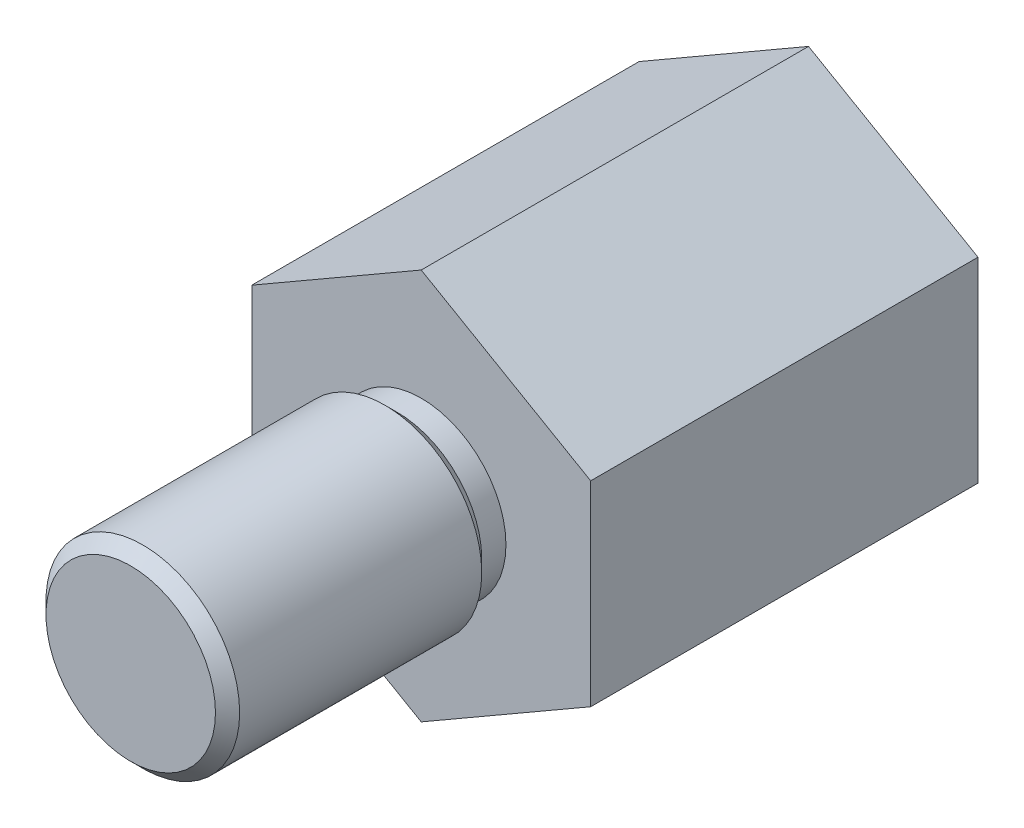
ISO-10303-21;
HEADER;
FILE_DESCRIPTION(('STEP AP214'),'2;1');
FILE_NAME('part.step','',(''),(''),'','','');
FILE_SCHEMA(('AUTOMOTIVE_DESIGN { 1 0 10303 214 1 1 1 1 }'));
ENDSEC;
DATA;
#1=APPLICATION_CONTEXT('core data for automotive mechanical design processes');
#2=APPLICATION_PROTOCOL_DEFINITION('international standard','automotive_design',2000,#1);
#3=PRODUCT_CONTEXT('',#1,'mechanical');
#4=PRODUCT('Part','Part','',(#3));
#5=PRODUCT_RELATED_PRODUCT_CATEGORY('part','',(#4));
#6=PRODUCT_DEFINITION_FORMATION('','',#4);
#7=PRODUCT_DEFINITION_CONTEXT('part definition',#1,'design');
#8=PRODUCT_DEFINITION('design','',#6,#7);
#9=PRODUCT_DEFINITION_SHAPE('','',#8);
#10=(LENGTH_UNIT() NAMED_UNIT(*) SI_UNIT(.MILLI.,.METRE.));
#11=(NAMED_UNIT(*) PLANE_ANGLE_UNIT() SI_UNIT($,.RADIAN.));
#12=(NAMED_UNIT(*) SI_UNIT($,.STERADIAN.) SOLID_ANGLE_UNIT());
#13=UNCERTAINTY_MEASURE_WITH_UNIT(LENGTH_MEASURE(1.E-05),#10,'distance_accuracy_value','');
#14=(GEOMETRIC_REPRESENTATION_CONTEXT(3) GLOBAL_UNCERTAINTY_ASSIGNED_CONTEXT((#13)) GLOBAL_UNIT_ASSIGNED_CONTEXT((#10,
#11,#12)) REPRESENTATION_CONTEXT('',''));
#15=CARTESIAN_POINT('',(0.,0.,0.));
#16=DIRECTION('',(0.,0.,1.));
#17=DIRECTION('',(1.,0.,0.));
#18=AXIS2_PLACEMENT_3D('',#15,#16,#17);
#19=CARTESIAN_POINT('',(0.,4.04145188432737,8.));
#20=DIRECTION('',(0.,0.,1.));
#21=DIRECTION('',(1.,0.,0.));
#22=AXIS2_PLACEMENT_3D('',#19,#20,#21);
#23=PLANE('',#22);
#24=DIRECTION('',(-0.866025403784438,0.5,0.));
#25=VECTOR('',#24,1.);
#26=CARTESIAN_POINT('',(3.49999999999999,2.02072594216368,8.));
#27=LINE('',#26,#25);
#28=CARTESIAN_POINT('',(3.49999999999999,2.02072594216368,8.));
#29=VERTEX_POINT('',#28);
#30=CARTESIAN_POINT('',(0.,4.04145188432737,8.));
#31=VERTEX_POINT('',#30);
#32=EDGE_CURVE('E130',#29,#31,#27,.T.);
#33=ORIENTED_EDGE('',*,*,#32,.T.);
#34=DIRECTION('',(-0.866025403784438,-0.5,0.));
#35=VECTOR('',#34,1.);
#36=CARTESIAN_POINT('',(0.,4.04145188432737,8.));
#37=LINE('',#36,#35);
#38=CARTESIAN_POINT('',(-3.5,2.02072594216368,8.));
#39=VERTEX_POINT('',#38);
#40=EDGE_CURVE('E87',#31,#39,#37,.T.);
#41=ORIENTED_EDGE('',*,*,#40,.T.);
#42=DIRECTION('',(0.,-1.,0.));
#43=VECTOR('',#42,1.);
#44=CARTESIAN_POINT('',(-3.5,2.02072594216368,8.));
#45=LINE('',#44,#43);
#46=CARTESIAN_POINT('',(-3.5,-2.0207259421637,8.));
#47=VERTEX_POINT('',#46);
#48=EDGE_CURVE('E101',#39,#47,#45,.T.);
#49=ORIENTED_EDGE('',*,*,#48,.T.);
#50=DIRECTION('',(0.866025403784438,-0.5,0.));
#51=VECTOR('',#50,1.);
#52=CARTESIAN_POINT('',(-3.5,-2.0207259421637,8.));
#53=LINE('',#52,#51);
#54=CARTESIAN_POINT('',(0.,-4.04145188432739,8.));
#55=VERTEX_POINT('',#54);
#56=EDGE_CURVE('E95',#47,#55,#53,.T.);
#57=ORIENTED_EDGE('',*,*,#56,.T.);
#58=DIRECTION('',(0.866025403784439,0.5,0.));
#59=VECTOR('',#58,1.);
#60=CARTESIAN_POINT('',(0.,-4.04145188432739,8.));
#61=LINE('',#60,#59);
#62=CARTESIAN_POINT('',(3.49999999999999,-2.0207259421637,8.));
#63=VERTEX_POINT('',#62);
#64=EDGE_CURVE('E99',#55,#63,#61,.T.);
#65=ORIENTED_EDGE('',*,*,#64,.T.);
#66=DIRECTION('',(0.,1.,0.));
#67=VECTOR('',#66,1.);
#68=CARTESIAN_POINT('',(3.49999999999999,-2.0207259421637,8.));
#69=LINE('',#68,#67);
#70=EDGE_CURVE('E48',#63,#29,#69,.T.);
#71=ORIENTED_EDGE('',*,*,#70,.T.);
#72=EDGE_LOOP('',(#33,#41,#49,#57,#65,#71));
#73=FACE_BOUND('',#72,.T.);
#74=CARTESIAN_POINT('',(0.,0.,8.));
#75=DIRECTION('',(0.,0.,1.));
#76=DIRECTION('',(1.,0.,0.));
#77=AXIS2_PLACEMENT_3D('',#74,#75,#76);
#78=CIRCLE('',#77,1.75);
#79=CARTESIAN_POINT('',(1.75,0.,8.));
#80=VERTEX_POINT('',#79);
#81=EDGE_CURVE('E197',#80,#80,#78,.T.);
#82=ORIENTED_EDGE('',*,*,#81,.F.);
#83=EDGE_LOOP('',(#82));
#84=FACE_BOUND('',#83,.T.);
#85=ADVANCED_FACE('F31',(#73,#84),#23,.T.);
#86=CARTESIAN_POINT('',(3.49999999999999,2.02072594216368,8.));
#87=DIRECTION('',(-0.5,-0.866025403784438,0.));
#88=DIRECTION('',(0.866025403784438,-0.5,0.));
#89=AXIS2_PLACEMENT_3D('',#86,#87,#88);
#90=PLANE('',#89);
#91=DIRECTION('',(-0.866025403784438,0.5,0.));
#92=VECTOR('',#91,1.);
#93=CARTESIAN_POINT('',(3.49999999999999,2.02072594216368,0.));
#94=LINE('',#93,#92);
#95=CARTESIAN_POINT('',(3.49999999999999,2.02072594216368,0.));
#96=VERTEX_POINT('',#95);
#97=CARTESIAN_POINT('',(0.,4.04145188432737,0.));
#98=VERTEX_POINT('',#97);
#99=EDGE_CURVE('E119',#96,#98,#94,.T.);
#100=ORIENTED_EDGE('',*,*,#99,.T.);
#101=DIRECTION('',(0.,0.,-1.));
#102=VECTOR('',#101,1.);
#103=CARTESIAN_POINT('',(0.,4.04145188432737,8.));
#104=LINE('',#103,#102);
#105=EDGE_CURVE('E137',#31,#98,#104,.T.);
#106=ORIENTED_EDGE('',*,*,#105,.F.);
#107=ORIENTED_EDGE('',*,*,#32,.F.);
#108=DIRECTION('',(0.,0.,-1.));
#109=VECTOR('',#108,1.);
#110=CARTESIAN_POINT('',(3.49999999999999,2.02072594216368,8.));
#111=LINE('',#110,#109);
#112=EDGE_CURVE('E115',#29,#96,#111,.T.);
#113=ORIENTED_EDGE('',*,*,#112,.T.);
#114=EDGE_LOOP('',(#100,#106,#107,#113));
#115=FACE_BOUND('',#114,.T.);
#116=ADVANCED_FACE('F161',(#115),#90,.F.);
#117=CARTESIAN_POINT('',(0.,4.04145188432737,8.));
#118=DIRECTION('',(0.5,-0.866025403784438,0.));
#119=DIRECTION('',(0.866025403784438,0.5,0.));
#120=AXIS2_PLACEMENT_3D('',#117,#118,#119);
#121=PLANE('',#120);
#122=DIRECTION('',(-0.866025403784438,-0.5,0.));
#123=VECTOR('',#122,1.);
#124=CARTESIAN_POINT('',(0.,4.04145188432737,0.));
#125=LINE('',#124,#123);
#126=CARTESIAN_POINT('',(-3.5,2.02072594216368,0.));
#127=VERTEX_POINT('',#126);
#128=EDGE_CURVE('E122',#98,#127,#125,.T.);
#129=ORIENTED_EDGE('',*,*,#128,.T.);
#130=DIRECTION('',(0.,0.,-1.));
#131=VECTOR('',#130,1.);
#132=CARTESIAN_POINT('',(-3.5,2.02072594216368,8.));
#133=LINE('',#132,#131);
#134=EDGE_CURVE('E134',#39,#127,#133,.T.);
#135=ORIENTED_EDGE('',*,*,#134,.F.);
#136=ORIENTED_EDGE('',*,*,#40,.F.);
#137=ORIENTED_EDGE('',*,*,#105,.T.);
#138=EDGE_LOOP('',(#129,#135,#136,#137));
#139=FACE_BOUND('',#138,.T.);
#140=ADVANCED_FACE('F166',(#139),#121,.F.);
#141=CARTESIAN_POINT('',(-3.5,2.02072594216368,8.));
#142=DIRECTION('',(1.,0.,0.));
#143=DIRECTION('',(0.,0.,-1.));
#144=AXIS2_PLACEMENT_3D('',#141,#142,#143);
#145=PLANE('',#144);
#146=DIRECTION('',(0.,-1.,0.));
#147=VECTOR('',#146,1.);
#148=CARTESIAN_POINT('',(-3.5,2.02072594216368,0.));
#149=LINE('',#148,#147);
#150=CARTESIAN_POINT('',(-3.5,-2.0207259421637,0.));
#151=VERTEX_POINT('',#150);
#152=EDGE_CURVE('E125',#127,#151,#149,.T.);
#153=ORIENTED_EDGE('',*,*,#152,.T.);
#154=DIRECTION('',(0.,0.,-1.));
#155=VECTOR('',#154,1.);
#156=CARTESIAN_POINT('',(-3.5,-2.0207259421637,8.));
#157=LINE('',#156,#155);
#158=EDGE_CURVE('E110',#47,#151,#157,.T.);
#159=ORIENTED_EDGE('',*,*,#158,.F.);
#160=ORIENTED_EDGE('',*,*,#48,.F.);
#161=ORIENTED_EDGE('',*,*,#134,.T.);
#162=EDGE_LOOP('',(#153,#159,#160,#161));
#163=FACE_BOUND('',#162,.T.);
#164=ADVANCED_FACE('F182',(#163),#145,.F.);
#165=CARTESIAN_POINT('',(-3.5,-2.0207259421637,8.));
#166=DIRECTION('',(0.5,0.866025403784439,0.));
#167=DIRECTION('',(-0.866025403784439,0.5,0.));
#168=AXIS2_PLACEMENT_3D('',#165,#166,#167);
#169=PLANE('',#168);
#170=DIRECTION('',(0.866025403784438,-0.5,0.));
#171=VECTOR('',#170,1.);
#172=CARTESIAN_POINT('',(-3.5,-2.0207259421637,0.));
#173=LINE('',#172,#171);
#174=CARTESIAN_POINT('',(0.,-4.04145188432739,0.));
#175=VERTEX_POINT('',#174);
#176=EDGE_CURVE('E109',#151,#175,#173,.T.);
#177=ORIENTED_EDGE('',*,*,#176,.T.);
#178=DIRECTION('',(0.,0.,-1.));
#179=VECTOR('',#178,1.);
#180=CARTESIAN_POINT('',(0.,-4.04145188432739,8.));
#181=LINE('',#180,#179);
#182=EDGE_CURVE('E106',#55,#175,#181,.T.);
#183=ORIENTED_EDGE('',*,*,#182,.F.);
#184=ORIENTED_EDGE('',*,*,#56,.F.);
#185=ORIENTED_EDGE('',*,*,#158,.T.);
#186=EDGE_LOOP('',(#177,#183,#184,#185));
#187=FACE_BOUND('',#186,.T.);
#188=ADVANCED_FACE('F107',(#187),#169,.F.);
#189=CARTESIAN_POINT('',(0.,-4.04145188432739,8.));
#190=DIRECTION('',(-0.5,0.866025403784439,0.));
#191=DIRECTION('',(-0.866025403784439,-0.5,0.));
#192=AXIS2_PLACEMENT_3D('',#189,#190,#191);
#193=PLANE('',#192);
#194=DIRECTION('',(0.866025403784439,0.5,0.));
#195=VECTOR('',#194,1.);
#196=CARTESIAN_POINT('',(0.,-4.04145188432739,0.));
#197=LINE('',#196,#195);
#198=CARTESIAN_POINT('',(3.49999999999999,-2.0207259421637,0.));
#199=VERTEX_POINT('',#198);
#200=EDGE_CURVE('E72',#175,#199,#197,.T.);
#201=ORIENTED_EDGE('',*,*,#200,.T.);
#202=DIRECTION('',(0.,0.,-1.));
#203=VECTOR('',#202,1.);
#204=CARTESIAN_POINT('',(3.49999999999999,-2.0207259421637,8.));
#205=LINE('',#204,#203);
#206=EDGE_CURVE('E111',#63,#199,#205,.T.);
#207=ORIENTED_EDGE('',*,*,#206,.F.);
#208=ORIENTED_EDGE('',*,*,#64,.F.);
#209=ORIENTED_EDGE('',*,*,#182,.T.);
#210=EDGE_LOOP('',(#201,#207,#208,#209));
#211=FACE_BOUND('',#210,.T.);
#212=ADVANCED_FACE('F113',(#211),#193,.F.);
#213=CARTESIAN_POINT('',(3.49999999999999,-2.0207259421637,8.));
#214=DIRECTION('',(-1.,0.,0.));
#215=DIRECTION('',(0.,-1.,0.));
#216=AXIS2_PLACEMENT_3D('',#213,#214,#215);
#217=PLANE('',#216);
#218=DIRECTION('',(0.,1.,0.));
#219=VECTOR('',#218,1.);
#220=CARTESIAN_POINT('',(3.49999999999999,-2.0207259421637,0.));
#221=LINE('',#220,#219);
#222=EDGE_CURVE('E78',#199,#96,#221,.T.);
#223=ORIENTED_EDGE('',*,*,#222,.T.);
#224=ORIENTED_EDGE('',*,*,#112,.F.);
#225=ORIENTED_EDGE('',*,*,#70,.F.);
#226=ORIENTED_EDGE('',*,*,#206,.T.);
#227=EDGE_LOOP('',(#223,#224,#225,#226));
#228=FACE_BOUND('',#227,.T.);
#229=ADVANCED_FACE('F174',(#228),#217,.F.);
#230=CARTESIAN_POINT('',(0.,4.04145188432737,0.));
#231=DIRECTION('',(0.,0.,1.));
#232=DIRECTION('',(1.,0.,0.));
#233=AXIS2_PLACEMENT_3D('',#230,#231,#232);
#234=PLANE('',#233);
#235=CARTESIAN_POINT('',(0.,0.,0.));
#236=DIRECTION('',(0.,0.,-1.));
#237=DIRECTION('',(-1.,0.,0.));
#238=AXIS2_PLACEMENT_3D('',#235,#236,#237);
#239=CIRCLE('',#238,2.);
#240=CARTESIAN_POINT('',(-2.,0.,0.));
#241=VERTEX_POINT('',#240);
#242=EDGE_CURVE('E200',#241,#241,#239,.T.);
#243=ORIENTED_EDGE('',*,*,#242,.F.);
#244=EDGE_LOOP('',(#243));
#245=FACE_BOUND('',#244,.T.);
#246=ORIENTED_EDGE('',*,*,#99,.F.);
#247=ORIENTED_EDGE('',*,*,#222,.F.);
#248=ORIENTED_EDGE('',*,*,#200,.F.);
#249=ORIENTED_EDGE('',*,*,#176,.F.);
#250=ORIENTED_EDGE('',*,*,#152,.F.);
#251=ORIENTED_EDGE('',*,*,#128,.F.);
#252=EDGE_LOOP('',(#246,#247,#248,#249,#250,#251));
#253=FACE_BOUND('',#252,.T.);
#254=ADVANCED_FACE('F170',(#245,#253),#234,.F.);
#255=CARTESIAN_POINT('',(0.,0.,8.5));
#256=DIRECTION('',(0.,0.,-1.));
#257=DIRECTION('',(-1.,0.,0.));
#258=AXIS2_PLACEMENT_3D('',#255,#256,#257);
#259=CYLINDRICAL_SURFACE('',#258,1.75);
#260=CARTESIAN_POINT('',(0.,0.,8.5));
#261=DIRECTION('',(0.,0.,1.));
#262=DIRECTION('',(1.,0.,0.));
#263=AXIS2_PLACEMENT_3D('',#260,#261,#262);
#264=CIRCLE('',#263,1.75);
#265=CARTESIAN_POINT('',(1.75,0.,8.5));
#266=VERTEX_POINT('',#265);
#267=EDGE_CURVE('E123',#266,#266,#264,.T.);
#268=ORIENTED_EDGE('',*,*,#267,.F.);
#269=EDGE_LOOP('',(#268));
#270=FACE_BOUND('',#269,.T.);
#271=ORIENTED_EDGE('',*,*,#81,.T.);
#272=EDGE_LOOP('',(#271));
#273=FACE_BOUND('',#272,.T.);
#274=ADVANCED_FACE('F173',(#270,#273),#259,.T.);
#275=CARTESIAN_POINT('',(0.,0.,14.));
#276=DIRECTION('',(0.,0.,1.));
#277=DIRECTION('',(1.,0.,0.));
#278=AXIS2_PLACEMENT_3D('',#275,#276,#277);
#279=PLANE('',#278);
#280=CARTESIAN_POINT('',(0.,0.,14.));
#281=DIRECTION('',(0.,0.,1.));
#282=DIRECTION('',(1.,0.,0.));
#283=AXIS2_PLACEMENT_3D('',#280,#281,#282);
#284=CIRCLE('',#283,1.75);
#285=CARTESIAN_POINT('',(1.75,0.,14.));
#286=VERTEX_POINT('',#285);
#287=EDGE_CURVE('E11',#286,#286,#284,.T.);
#288=ORIENTED_EDGE('',*,*,#287,.T.);
#289=EDGE_LOOP('',(#288));
#290=FACE_BOUND('',#289,.T.);
#291=ADVANCED_FACE('F156',(#290),#279,.T.);
#292=CARTESIAN_POINT('',(0.,0.,14.));
#293=DIRECTION('',(0.,0.,-1.));
#294=DIRECTION('',(-1.,0.,0.));
#295=AXIS2_PLACEMENT_3D('',#292,#293,#294);
#296=CYLINDRICAL_SURFACE('',#295,2.);
#297=CARTESIAN_POINT('',(0.,0.,8.75));
#298=DIRECTION('',(0.,0.,1.));
#299=DIRECTION('',(1.,0.,0.));
#300=AXIS2_PLACEMENT_3D('',#297,#298,#299);
#301=CIRCLE('',#300,2.);
#302=CARTESIAN_POINT('',(2.,0.,8.75));
#303=VERTEX_POINT('',#302);
#304=EDGE_CURVE('E40',#303,#303,#301,.T.);
#305=ORIENTED_EDGE('',*,*,#304,.T.);
#306=EDGE_LOOP('',(#305));
#307=FACE_BOUND('',#306,.T.);
#308=CARTESIAN_POINT('',(0.,0.,13.75));
#309=DIRECTION('',(0.,0.,1.));
#310=DIRECTION('',(1.,0.,0.));
#311=AXIS2_PLACEMENT_3D('',#308,#309,#310);
#312=CIRCLE('',#311,2.);
#313=CARTESIAN_POINT('',(2.,0.,13.75));
#314=VERTEX_POINT('',#313);
#315=EDGE_CURVE('E139',#314,#314,#312,.F.);
#316=ORIENTED_EDGE('',*,*,#315,.T.);
#317=EDGE_LOOP('',(#316));
#318=FACE_BOUND('',#317,.T.);
#319=ADVANCED_FACE('F144',(#307,#318),#296,.T.);
#320=CARTESIAN_POINT('',(0.,0.,8.75));
#321=DIRECTION('',(0.,0.,1.));
#322=DIRECTION('',(1.,0.,0.));
#323=AXIS2_PLACEMENT_3D('',#320,#321,#322);
#324=CONICAL_SURFACE('',#323,2.,0.785398163397455);
#325=ORIENTED_EDGE('',*,*,#267,.T.);
#326=EDGE_LOOP('',(#325));
#327=FACE_BOUND('',#326,.T.);
#328=ORIENTED_EDGE('',*,*,#304,.F.);
#329=EDGE_LOOP('',(#328));
#330=FACE_BOUND('',#329,.T.);
#331=ADVANCED_FACE('F147',(#327,#330),#324,.T.);
#332=CARTESIAN_POINT('',(0.,0.,14.));
#333=DIRECTION('',(0.,0.,-1.));
#334=DIRECTION('',(-1.,0.,0.));
#335=AXIS2_PLACEMENT_3D('',#332,#333,#334);
#336=CONICAL_SURFACE('',#335,1.75,0.785398163397447);
#337=ORIENTED_EDGE('',*,*,#315,.F.);
#338=EDGE_LOOP('',(#337));
#339=FACE_BOUND('',#338,.T.);
#340=ORIENTED_EDGE('',*,*,#287,.F.);
#341=EDGE_LOOP('',(#340));
#342=FACE_BOUND('',#341,.T.);
#343=ADVANCED_FACE('F33',(#339,#342),#336,.T.);
#344=CARTESIAN_POINT('',(0.,0.,0.));
#345=DIRECTION('',(0.,0.,-1.));
#346=DIRECTION('',(-1.,0.,0.));
#347=AXIS2_PLACEMENT_3D('',#344,#345,#346);
#348=CONICAL_SURFACE('',#347,2.,0.785398163397446);
#349=CARTESIAN_POINT('',(0.,0.,0.350000000000001));
#350=DIRECTION('',(0.,0.,-1.));
#351=DIRECTION('',(-1.,0.,0.));
#352=AXIS2_PLACEMENT_3D('',#349,#350,#351);
#353=CIRCLE('',#352,1.65);
#354=CARTESIAN_POINT('',(-1.65,0.,0.350000000000001));
#355=VERTEX_POINT('',#354);
#356=EDGE_CURVE('E204',#355,#355,#353,.T.);
#357=ORIENTED_EDGE('',*,*,#356,.F.);
#358=EDGE_LOOP('',(#357));
#359=FACE_BOUND('',#358,.T.);
#360=ORIENTED_EDGE('',*,*,#242,.T.);
#361=EDGE_LOOP('',(#360));
#362=FACE_BOUND('',#361,.T.);
#363=ADVANCED_FACE('F154',(#359,#362),#348,.F.);
#364=CARTESIAN_POINT('',(0.,0.,0.));
#365=DIRECTION('',(0.,0.,-1.));
#366=DIRECTION('',(-1.,0.,0.));
#367=AXIS2_PLACEMENT_3D('',#364,#365,#366);
#368=CYLINDRICAL_SURFACE('',#367,1.65);
#369=CARTESIAN_POINT('',(0.,0.,6.));
#370=DIRECTION('',(0.,0.,-1.));
#371=DIRECTION('',(-1.,0.,0.));
#372=AXIS2_PLACEMENT_3D('',#369,#370,#371);
#373=CIRCLE('',#372,1.65);
#374=CARTESIAN_POINT('',(-1.65,0.,6.));
#375=VERTEX_POINT('',#374);
#376=EDGE_CURVE('E207',#375,#375,#373,.T.);
#377=ORIENTED_EDGE('',*,*,#376,.F.);
#378=EDGE_LOOP('',(#377));
#379=FACE_BOUND('',#378,.T.);
#380=ORIENTED_EDGE('',*,*,#356,.T.);
#381=EDGE_LOOP('',(#380));
#382=FACE_BOUND('',#381,.T.);
#383=ADVANCED_FACE('F213',(#379,#382),#368,.F.);
#384=CARTESIAN_POINT('',(0.,0.,6.));
#385=DIRECTION('',(0.,0.,-1.));
#386=DIRECTION('',(-1.,0.,0.));
#387=AXIS2_PLACEMENT_3D('',#384,#385,#386);
#388=CONICAL_SURFACE('',#387,1.65,1.02974425867665);
#389=CARTESIAN_POINT('',(0.,0.,6.99142002139547));
#390=VERTEX_POINT('',#389);
#391=VERTEX_LOOP('',#390);
#392=FACE_BOUND('',#391,.T.);
#393=ORIENTED_EDGE('',*,*,#376,.T.);
#394=EDGE_LOOP('',(#393));
#395=FACE_BOUND('',#394,.T.);
#396=ADVANCED_FACE('F211',(#392,#395),#388,.F.);
#397=CLOSED_SHELL('',(#85,#116,#140,#164,#188,#212,#229,#254,#274,#291,#319,#331,#343,#363,#383,#396));
#398=MANIFOLD_SOLID_BREP('B2',#397);
#399=ADVANCED_BREP_SHAPE_REPRESENTATION('',(#18,#398),#14);
#400=SHAPE_DEFINITION_REPRESENTATION(#9,#399);
ENDSEC;
END-ISO-10303-21;
